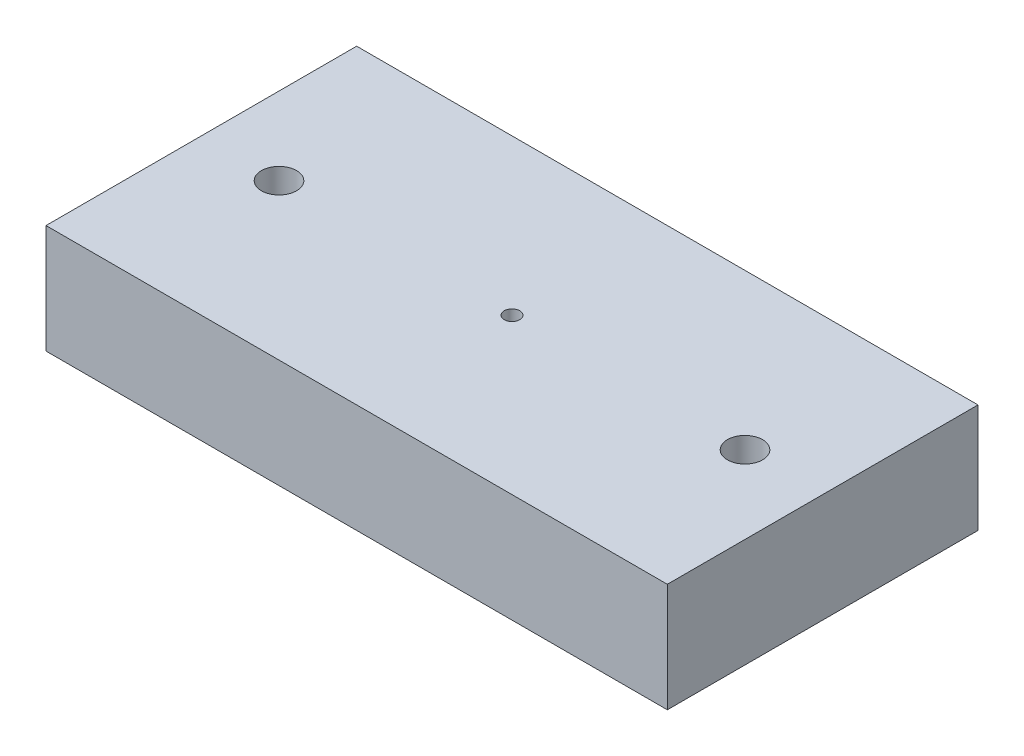
ISO-10303-21;
HEADER;
FILE_DESCRIPTION(('STEP AP214'),'2;1');
FILE_NAME('part.step','',(''),(''),'','','');
FILE_SCHEMA(('AUTOMOTIVE_DESIGN { 1 0 10303 214 1 1 1 1 }'));
ENDSEC;
DATA;
#1=APPLICATION_CONTEXT('core data for automotive mechanical design processes');
#2=APPLICATION_PROTOCOL_DEFINITION('international standard','automotive_design',2000,#1);
#3=PRODUCT_CONTEXT('',#1,'mechanical');
#4=PRODUCT('Part','Part','',(#3));
#5=PRODUCT_RELATED_PRODUCT_CATEGORY('part','',(#4));
#6=PRODUCT_DEFINITION_FORMATION('','',#4);
#7=PRODUCT_DEFINITION_CONTEXT('part definition',#1,'design');
#8=PRODUCT_DEFINITION('design','',#6,#7);
#9=PRODUCT_DEFINITION_SHAPE('','',#8);
#10=(LENGTH_UNIT() NAMED_UNIT(*) SI_UNIT(.MILLI.,.METRE.));
#11=(NAMED_UNIT(*) PLANE_ANGLE_UNIT() SI_UNIT($,.RADIAN.));
#12=(NAMED_UNIT(*) SI_UNIT($,.STERADIAN.) SOLID_ANGLE_UNIT());
#13=UNCERTAINTY_MEASURE_WITH_UNIT(LENGTH_MEASURE(1.E-05),#10,'distance_accuracy_value','');
#14=(GEOMETRIC_REPRESENTATION_CONTEXT(3) GLOBAL_UNCERTAINTY_ASSIGNED_CONTEXT((#13)) GLOBAL_UNIT_ASSIGNED_CONTEXT((#10,
#11,#12)) REPRESENTATION_CONTEXT('',''));
#15=CARTESIAN_POINT('',(0.,0.,0.));
#16=DIRECTION('',(0.,0.,1.));
#17=DIRECTION('',(1.,0.,0.));
#18=AXIS2_PLACEMENT_3D('',#15,#16,#17);
#19=CARTESIAN_POINT('',(0.,0.280000000000001,0.));
#20=DIRECTION('',(0.,1.,0.));
#21=DIRECTION('',(0.,0.,1.));
#22=AXIS2_PLACEMENT_3D('',#19,#20,#21);
#23=CYLINDRICAL_SURFACE('',#22,0.5);
#24=CARTESIAN_POINT('',(0.,7.,0.));
#25=DIRECTION('',(0.,1.,0.));
#26=DIRECTION('',(0.,0.,1.));
#27=AXIS2_PLACEMENT_3D('',#24,#25,#26);
#28=CIRCLE('',#27,0.5);
#29=CARTESIAN_POINT('',(0.,7.,0.5));
#30=VERTEX_POINT('',#29);
#31=EDGE_CURVE('E179',#30,#30,#28,.T.);
#32=ORIENTED_EDGE('',*,*,#31,.T.);
#33=EDGE_LOOP('',(#32));
#34=FACE_BOUND('',#33,.T.);
#35=CARTESIAN_POINT('',(0.,0.5,0.));
#36=DIRECTION('',(0.,-1.,0.));
#37=DIRECTION('',(0.,0.,-1.));
#38=AXIS2_PLACEMENT_3D('',#35,#36,#37);
#39=CIRCLE('',#38,0.5);
#40=CARTESIAN_POINT('',(0.,0.5,-0.5));
#41=VERTEX_POINT('',#40);
#42=EDGE_CURVE('E39',#41,#41,#39,.F.);
#43=ORIENTED_EDGE('',*,*,#42,.F.);
#44=EDGE_LOOP('',(#43));
#45=FACE_BOUND('',#44,.T.);
#46=ADVANCED_FACE('F35',(#34,#45),#23,.F.);
#47=CARTESIAN_POINT('',(20.,7.,10.));
#48=DIRECTION('',(-1.,0.,0.));
#49=DIRECTION('',(0.,0.,1.));
#50=AXIS2_PLACEMENT_3D('',#47,#48,#49);
#51=PLANE('',#50);
#52=DIRECTION('',(0.,0.,-1.));
#53=VECTOR('',#52,1.);
#54=CARTESIAN_POINT('',(20.,0.,10.));
#55=LINE('',#54,#53);
#56=CARTESIAN_POINT('',(20.,0.,10.));
#57=VERTEX_POINT('',#56);
#58=CARTESIAN_POINT('',(20.,0.,-10.));
#59=VERTEX_POINT('',#58);
#60=EDGE_CURVE('E182',#57,#59,#55,.T.);
#61=ORIENTED_EDGE('',*,*,#60,.T.);
#62=DIRECTION('',(0.,-1.,0.));
#63=VECTOR('',#62,1.);
#64=CARTESIAN_POINT('',(20.,7.,-10.));
#65=LINE('',#64,#63);
#66=CARTESIAN_POINT('',(20.,7.,-10.));
#67=VERTEX_POINT('',#66);
#68=EDGE_CURVE('E11',#67,#59,#65,.T.);
#69=ORIENTED_EDGE('',*,*,#68,.F.);
#70=DIRECTION('',(0.,0.,-1.));
#71=VECTOR('',#70,1.);
#72=CARTESIAN_POINT('',(20.,7.,10.));
#73=LINE('',#72,#71);
#74=CARTESIAN_POINT('',(20.,7.,10.));
#75=VERTEX_POINT('',#74);
#76=EDGE_CURVE('E183',#75,#67,#73,.T.);
#77=ORIENTED_EDGE('',*,*,#76,.F.);
#78=DIRECTION('',(0.,-1.,0.));
#79=VECTOR('',#78,1.);
#80=CARTESIAN_POINT('',(20.,7.,10.));
#81=LINE('',#80,#79);
#82=EDGE_CURVE('E189',#75,#57,#81,.T.);
#83=ORIENTED_EDGE('',*,*,#82,.T.);
#84=EDGE_LOOP('',(#61,#69,#77,#83));
#85=FACE_BOUND('',#84,.T.);
#86=ADVANCED_FACE('F37',(#85),#51,.F.);
#87=CARTESIAN_POINT('',(-20.,7.,-10.));
#88=DIRECTION('',(0.,0.,1.));
#89=DIRECTION('',(1.,0.,0.));
#90=AXIS2_PLACEMENT_3D('',#87,#88,#89);
#91=PLANE('',#90);
#92=DIRECTION('',(-1.,0.,0.));
#93=VECTOR('',#92,1.);
#94=CARTESIAN_POINT('',(-20.,0.,-10.));
#95=LINE('',#94,#93);
#96=CARTESIAN_POINT('',(-20.,0.,-10.));
#97=VERTEX_POINT('',#96);
#98=EDGE_CURVE('E192',#59,#97,#95,.T.);
#99=ORIENTED_EDGE('',*,*,#98,.T.);
#100=DIRECTION('',(0.,-1.,0.));
#101=VECTOR('',#100,1.);
#102=CARTESIAN_POINT('',(-20.,7.,-10.));
#103=LINE('',#102,#101);
#104=CARTESIAN_POINT('',(-20.,7.,-10.));
#105=VERTEX_POINT('',#104);
#106=EDGE_CURVE('E44',#105,#97,#103,.T.);
#107=ORIENTED_EDGE('',*,*,#106,.F.);
#108=DIRECTION('',(-1.,0.,0.));
#109=VECTOR('',#108,1.);
#110=CARTESIAN_POINT('',(-20.,7.,-10.));
#111=LINE('',#110,#109);
#112=EDGE_CURVE('E88',#67,#105,#111,.T.);
#113=ORIENTED_EDGE('',*,*,#112,.F.);
#114=ORIENTED_EDGE('',*,*,#68,.T.);
#115=EDGE_LOOP('',(#99,#107,#113,#114));
#116=FACE_BOUND('',#115,.T.);
#117=ADVANCED_FACE('F222',(#116),#91,.F.);
#118=CARTESIAN_POINT('',(-20.,7.,10.));
#119=DIRECTION('',(1.,0.,0.));
#120=DIRECTION('',(0.,0.,-1.));
#121=AXIS2_PLACEMENT_3D('',#118,#119,#120);
#122=PLANE('',#121);
#123=DIRECTION('',(0.,0.,1.));
#124=VECTOR('',#123,1.);
#125=CARTESIAN_POINT('',(-20.,0.,10.));
#126=LINE('',#125,#124);
#127=CARTESIAN_POINT('',(-20.,0.,10.));
#128=VERTEX_POINT('',#127);
#129=EDGE_CURVE('E194',#97,#128,#126,.T.);
#130=ORIENTED_EDGE('',*,*,#129,.T.);
#131=DIRECTION('',(0.,-1.,0.));
#132=VECTOR('',#131,1.);
#133=CARTESIAN_POINT('',(-20.,7.,10.));
#134=LINE('',#133,#132);
#135=CARTESIAN_POINT('',(-20.,7.,10.));
#136=VERTEX_POINT('',#135);
#137=EDGE_CURVE('E198',#136,#128,#134,.T.);
#138=ORIENTED_EDGE('',*,*,#137,.F.);
#139=DIRECTION('',(0.,0.,1.));
#140=VECTOR('',#139,1.);
#141=CARTESIAN_POINT('',(-20.,7.,10.));
#142=LINE('',#141,#140);
#143=EDGE_CURVE('E186',#105,#136,#142,.T.);
#144=ORIENTED_EDGE('',*,*,#143,.F.);
#145=ORIENTED_EDGE('',*,*,#106,.T.);
#146=EDGE_LOOP('',(#130,#138,#144,#145));
#147=FACE_BOUND('',#146,.T.);
#148=ADVANCED_FACE('F204',(#147),#122,.F.);
#149=CARTESIAN_POINT('',(-20.,7.,10.));
#150=DIRECTION('',(0.,0.,-1.));
#151=DIRECTION('',(-1.,0.,0.));
#152=AXIS2_PLACEMENT_3D('',#149,#150,#151);
#153=PLANE('',#152);
#154=DIRECTION('',(1.,0.,0.));
#155=VECTOR('',#154,1.);
#156=CARTESIAN_POINT('',(-20.,0.,10.));
#157=LINE('',#156,#155);
#158=EDGE_CURVE('E81',#128,#57,#157,.T.);
#159=ORIENTED_EDGE('',*,*,#158,.T.);
#160=ORIENTED_EDGE('',*,*,#82,.F.);
#161=DIRECTION('',(1.,0.,0.));
#162=VECTOR('',#161,1.);
#163=CARTESIAN_POINT('',(-20.,7.,10.));
#164=LINE('',#163,#162);
#165=EDGE_CURVE('E60',#136,#75,#164,.T.);
#166=ORIENTED_EDGE('',*,*,#165,.F.);
#167=ORIENTED_EDGE('',*,*,#137,.T.);
#168=EDGE_LOOP('',(#159,#160,#166,#167));
#169=FACE_BOUND('',#168,.T.);
#170=ADVANCED_FACE('F212',(#169),#153,.F.);
#171=CARTESIAN_POINT('',(0.,7.,0.));
#172=DIRECTION('',(0.,-1.,0.));
#173=DIRECTION('',(0.,0.,-1.));
#174=AXIS2_PLACEMENT_3D('',#171,#172,#173);
#175=PLANE('',#174);
#176=CARTESIAN_POINT('',(15.,7.,0.));
#177=DIRECTION('',(0.,-1.,0.));
#178=DIRECTION('',(0.,0.,-1.));
#179=AXIS2_PLACEMENT_3D('',#176,#177,#178);
#180=CIRCLE('',#179,1.1303);
#181=CARTESIAN_POINT('',(15.,7.,-1.13029999999999));
#182=VERTEX_POINT('',#181);
#183=EDGE_CURVE('E167',#182,#182,#180,.T.);
#184=ORIENTED_EDGE('',*,*,#183,.T.);
#185=EDGE_LOOP('',(#184));
#186=FACE_BOUND('',#185,.T.);
#187=CARTESIAN_POINT('',(-15.,7.,0.));
#188=DIRECTION('',(0.,-1.,0.));
#189=DIRECTION('',(0.,0.,-1.));
#190=AXIS2_PLACEMENT_3D('',#187,#188,#189);
#191=CIRCLE('',#190,1.1303);
#192=CARTESIAN_POINT('',(-15.,7.,-1.1303));
#193=VERTEX_POINT('',#192);
#194=EDGE_CURVE('E176',#193,#193,#191,.T.);
#195=ORIENTED_EDGE('',*,*,#194,.T.);
#196=EDGE_LOOP('',(#195));
#197=FACE_BOUND('',#196,.T.);
#198=ORIENTED_EDGE('',*,*,#31,.F.);
#199=EDGE_LOOP('',(#198));
#200=FACE_BOUND('',#199,.T.);
#201=ORIENTED_EDGE('',*,*,#76,.T.);
#202=ORIENTED_EDGE('',*,*,#112,.T.);
#203=ORIENTED_EDGE('',*,*,#143,.T.);
#204=ORIENTED_EDGE('',*,*,#165,.T.);
#205=EDGE_LOOP('',(#201,#202,#203,#204));
#206=FACE_BOUND('',#205,.T.);
#207=ADVANCED_FACE('F214',(#186,#197,#200,#206),#175,.F.);
#208=CARTESIAN_POINT('',(0.,0.,0.));
#209=DIRECTION('',(0.,-1.,0.));
#210=DIRECTION('',(0.,0.,-1.));
#211=AXIS2_PLACEMENT_3D('',#208,#209,#210);
#212=PLANE('',#211);
#213=CARTESIAN_POINT('',(0.,0.,0.));
#214=DIRECTION('',(0.,-1.,0.));
#215=DIRECTION('',(0.,0.,-1.));
#216=AXIS2_PLACEMENT_3D('',#213,#214,#215);
#217=CIRCLE('',#216,5.55);
#218=CARTESIAN_POINT('',(0.,0.,-5.55));
#219=VERTEX_POINT('',#218);
#220=EDGE_CURVE('E152',#219,#219,#217,.T.);
#221=ORIENTED_EDGE('',*,*,#220,.F.);
#222=EDGE_LOOP('',(#221));
#223=FACE_BOUND('',#222,.T.);
#224=CARTESIAN_POINT('',(15.,0.,0.));
#225=DIRECTION('',(0.,-1.,0.));
#226=DIRECTION('',(0.,0.,-1.));
#227=AXIS2_PLACEMENT_3D('',#224,#225,#226);
#228=CIRCLE('',#227,1.7653);
#229=CARTESIAN_POINT('',(15.,0.,-1.7653));
#230=VERTEX_POINT('',#229);
#231=EDGE_CURVE('E159',#230,#230,#228,.T.);
#232=ORIENTED_EDGE('',*,*,#231,.F.);
#233=EDGE_LOOP('',(#232));
#234=FACE_BOUND('',#233,.T.);
#235=CARTESIAN_POINT('',(-15.,0.,0.));
#236=DIRECTION('',(0.,-1.,0.));
#237=DIRECTION('',(0.,0.,-1.));
#238=AXIS2_PLACEMENT_3D('',#235,#236,#237);
#239=CIRCLE('',#238,1.7653);
#240=CARTESIAN_POINT('',(-15.,0.,-1.7653));
#241=VERTEX_POINT('',#240);
#242=EDGE_CURVE('E170',#241,#241,#239,.T.);
#243=ORIENTED_EDGE('',*,*,#242,.F.);
#244=EDGE_LOOP('',(#243));
#245=FACE_BOUND('',#244,.T.);
#246=ORIENTED_EDGE('',*,*,#60,.F.);
#247=ORIENTED_EDGE('',*,*,#158,.F.);
#248=ORIENTED_EDGE('',*,*,#129,.F.);
#249=ORIENTED_EDGE('',*,*,#98,.F.);
#250=EDGE_LOOP('',(#246,#247,#248,#249));
#251=FACE_BOUND('',#250,.T.);
#252=ADVANCED_FACE('F208',(#223,#234,#245,#251),#212,.T.);
#253=CARTESIAN_POINT('',(-15.,0.,0.));
#254=DIRECTION('',(0.,-1.,0.));
#255=DIRECTION('',(0.,0.,-1.));
#256=AXIS2_PLACEMENT_3D('',#253,#254,#255);
#257=CYLINDRICAL_SURFACE('',#256,1.1303);
#258=ORIENTED_EDGE('',*,*,#194,.F.);
#259=EDGE_LOOP('',(#258));
#260=FACE_BOUND('',#259,.T.);
#261=CARTESIAN_POINT('',(-15.,0.634999999999999,0.));
#262=DIRECTION('',(0.,-1.,0.));
#263=DIRECTION('',(0.,0.,-1.));
#264=AXIS2_PLACEMENT_3D('',#261,#262,#263);
#265=CIRCLE('',#264,1.1303);
#266=CARTESIAN_POINT('',(-15.,0.634999999999999,-1.1303));
#267=VERTEX_POINT('',#266);
#268=EDGE_CURVE('E173',#267,#267,#265,.T.);
#269=ORIENTED_EDGE('',*,*,#268,.T.);
#270=EDGE_LOOP('',(#269));
#271=FACE_BOUND('',#270,.T.);
#272=ADVANCED_FACE('F233',(#260,#271),#257,.F.);
#273=CARTESIAN_POINT('',(-15.,0.,0.));
#274=DIRECTION('',(0.,-1.,0.));
#275=DIRECTION('',(0.,0.,-1.));
#276=AXIS2_PLACEMENT_3D('',#273,#274,#275);
#277=CONICAL_SURFACE('',#276,1.7653,0.785398163397449);
#278=ORIENTED_EDGE('',*,*,#268,.F.);
#279=EDGE_LOOP('',(#278));
#280=FACE_BOUND('',#279,.T.);
#281=ORIENTED_EDGE('',*,*,#242,.T.);
#282=EDGE_LOOP('',(#281));
#283=FACE_BOUND('',#282,.T.);
#284=ADVANCED_FACE('F241',(#280,#283),#277,.F.);
#285=CARTESIAN_POINT('',(15.,0.,0.));
#286=DIRECTION('',(0.,-1.,0.));
#287=DIRECTION('',(0.,0.,-1.));
#288=AXIS2_PLACEMENT_3D('',#285,#286,#287);
#289=CYLINDRICAL_SURFACE('',#288,1.1303);
#290=ORIENTED_EDGE('',*,*,#183,.F.);
#291=EDGE_LOOP('',(#290));
#292=FACE_BOUND('',#291,.T.);
#293=CARTESIAN_POINT('',(15.,0.634999999999999,0.));
#294=DIRECTION('',(0.,-1.,0.));
#295=DIRECTION('',(0.,0.,-1.));
#296=AXIS2_PLACEMENT_3D('',#293,#294,#295);
#297=CIRCLE('',#296,1.1303);
#298=CARTESIAN_POINT('',(15.,0.634999999999999,-1.13029999999999));
#299=VERTEX_POINT('',#298);
#300=EDGE_CURVE('E164',#299,#299,#297,.T.);
#301=ORIENTED_EDGE('',*,*,#300,.T.);
#302=EDGE_LOOP('',(#301));
#303=FACE_BOUND('',#302,.T.);
#304=ADVANCED_FACE('F286',(#292,#303),#289,.F.);
#305=CARTESIAN_POINT('',(15.,0.,0.));
#306=DIRECTION('',(0.,-1.,0.));
#307=DIRECTION('',(0.,0.,-1.));
#308=AXIS2_PLACEMENT_3D('',#305,#306,#307);
#309=CONICAL_SURFACE('',#308,1.7653,0.78539816339745);
#310=ORIENTED_EDGE('',*,*,#300,.F.);
#311=EDGE_LOOP('',(#310));
#312=FACE_BOUND('',#311,.T.);
#313=ORIENTED_EDGE('',*,*,#231,.T.);
#314=EDGE_LOOP('',(#313));
#315=FACE_BOUND('',#314,.T.);
#316=ADVANCED_FACE('F282',(#312,#315),#309,.F.);
#317=CARTESIAN_POINT('',(0.,4.9,0.));
#318=DIRECTION('',(0.,-1.,0.));
#319=DIRECTION('',(0.,0.,-1.));
#320=AXIS2_PLACEMENT_3D('',#317,#318,#319);
#321=CYLINDRICAL_SURFACE('',#320,5.55);
#322=CARTESIAN_POINT('',(0.,4.9,0.));
#323=DIRECTION('',(0.,-1.,0.));
#324=DIRECTION('',(0.,0.,-1.));
#325=AXIS2_PLACEMENT_3D('',#322,#323,#324);
#326=CIRCLE('',#325,5.55);
#327=CARTESIAN_POINT('',(0.,4.9,-5.55));
#328=VERTEX_POINT('',#327);
#329=EDGE_CURVE('E156',#328,#328,#326,.T.);
#330=ORIENTED_EDGE('',*,*,#329,.F.);
#331=EDGE_LOOP('',(#330));
#332=FACE_BOUND('',#331,.T.);
#333=ORIENTED_EDGE('',*,*,#220,.T.);
#334=EDGE_LOOP('',(#333));
#335=FACE_BOUND('',#334,.T.);
#336=ADVANCED_FACE('F278',(#332,#335),#321,.F.);
#337=CARTESIAN_POINT('',(0.,4.9,0.));
#338=DIRECTION('',(0.,-1.,0.));
#339=DIRECTION('',(0.,0.,-1.));
#340=AXIS2_PLACEMENT_3D('',#337,#338,#339);
#341=PLANE('',#340);
#342=CARTESIAN_POINT('',(0.,4.9,0.));
#343=DIRECTION('',(0.,-1.,0.));
#344=DIRECTION('',(0.,0.,-1.));
#345=AXIS2_PLACEMENT_3D('',#342,#343,#344);
#346=CIRCLE('',#345,3.97);
#347=CARTESIAN_POINT('',(0.,4.9,-3.97));
#348=VERTEX_POINT('',#347);
#349=EDGE_CURVE('E149',#348,#348,#346,.T.);
#350=ORIENTED_EDGE('',*,*,#349,.F.);
#351=EDGE_LOOP('',(#350));
#352=FACE_BOUND('',#351,.T.);
#353=ORIENTED_EDGE('',*,*,#329,.T.);
#354=EDGE_LOOP('',(#353));
#355=FACE_BOUND('',#354,.T.);
#356=ADVANCED_FACE('F253',(#352,#355),#341,.T.);
#357=CARTESIAN_POINT('',(0.,4.9,0.));
#358=DIRECTION('',(0.,-1.,0.));
#359=DIRECTION('',(0.,0.,-1.));
#360=AXIS2_PLACEMENT_3D('',#357,#358,#359);
#361=CYLINDRICAL_SURFACE('',#360,3.97);
#362=ORIENTED_EDGE('',*,*,#349,.T.);
#363=EDGE_LOOP('',(#362));
#364=FACE_BOUND('',#363,.T.);
#365=CARTESIAN_POINT('',(0.,0.,0.));
#366=DIRECTION('',(0.,-1.,0.));
#367=DIRECTION('',(0.,0.,-1.));
#368=AXIS2_PLACEMENT_3D('',#365,#366,#367);
#369=CIRCLE('',#368,3.97);
#370=CARTESIAN_POINT('',(0.,0.,-3.97));
#371=VERTEX_POINT('',#370);
#372=EDGE_CURVE('E153',#371,#371,#369,.T.);
#373=ORIENTED_EDGE('',*,*,#372,.F.);
#374=EDGE_LOOP('',(#373));
#375=FACE_BOUND('',#374,.T.);
#376=ADVANCED_FACE('F246',(#364,#375),#361,.T.);
#377=DIRECTION('',(0.,0.,1.));
#378=VECTOR('',#377,1.);
#379=CARTESIAN_POINT('',(2.5,0.,1.75));
#380=LINE('',#379,#378);
#381=CARTESIAN_POINT('',(2.5,0.,-1.75));
#382=VERTEX_POINT('',#381);
#383=CARTESIAN_POINT('',(2.5,0.,1.75));
#384=VERTEX_POINT('',#383);
#385=EDGE_CURVE('E51',#382,#384,#380,.T.);
#386=ORIENTED_EDGE('',*,*,#385,.F.);
#387=DIRECTION('',(1.,0.,0.));
#388=VECTOR('',#387,1.);
#389=CARTESIAN_POINT('',(-2.5,0.,-1.75));
#390=LINE('',#389,#388);
#391=CARTESIAN_POINT('',(-2.5,0.,-1.75));
#392=VERTEX_POINT('',#391);
#393=EDGE_CURVE('E131',#392,#382,#390,.T.);
#394=ORIENTED_EDGE('',*,*,#393,.F.);
#395=DIRECTION('',(0.,0.,-1.));
#396=VECTOR('',#395,1.);
#397=CARTESIAN_POINT('',(-2.5,0.,1.75));
#398=LINE('',#397,#396);
#399=CARTESIAN_POINT('',(-2.5,0.,1.75));
#400=VERTEX_POINT('',#399);
#401=EDGE_CURVE('E134',#400,#392,#398,.T.);
#402=ORIENTED_EDGE('',*,*,#401,.F.);
#403=DIRECTION('',(-1.,0.,0.));
#404=VECTOR('',#403,1.);
#405=CARTESIAN_POINT('',(-2.5,0.,1.75));
#406=LINE('',#405,#404);
#407=EDGE_CURVE('E140',#384,#400,#406,.T.);
#408=ORIENTED_EDGE('',*,*,#407,.F.);
#409=EDGE_LOOP('',(#386,#394,#402,#408));
#410=FACE_BOUND('',#409,.T.);
#411=ORIENTED_EDGE('',*,*,#372,.T.);
#412=EDGE_LOOP('',(#411));
#413=FACE_BOUND('',#412,.T.);
#414=ADVANCED_FACE('F237',(#410,#413),#212,.T.);
#415=CARTESIAN_POINT('',(0.,0.5,0.));
#416=DIRECTION('',(0.,-1.,0.));
#417=DIRECTION('',(0.,0.,-1.));
#418=AXIS2_PLACEMENT_3D('',#415,#416,#417);
#419=PLANE('',#418);
#420=DIRECTION('',(0.,0.,1.));
#421=VECTOR('',#420,1.);
#422=CARTESIAN_POINT('',(2.5,0.5,1.75));
#423=LINE('',#422,#421);
#424=CARTESIAN_POINT('',(2.5,0.5,-1.75));
#425=VERTEX_POINT('',#424);
#426=CARTESIAN_POINT('',(2.5,0.5,1.75));
#427=VERTEX_POINT('',#426);
#428=EDGE_CURVE('E112',#425,#427,#423,.T.);
#429=ORIENTED_EDGE('',*,*,#428,.T.);
#430=DIRECTION('',(-1.,0.,0.));
#431=VECTOR('',#430,1.);
#432=CARTESIAN_POINT('',(-2.5,0.5,1.75));
#433=LINE('',#432,#431);
#434=CARTESIAN_POINT('',(-2.5,0.5,1.75));
#435=VERTEX_POINT('',#434);
#436=EDGE_CURVE('E121',#427,#435,#433,.T.);
#437=ORIENTED_EDGE('',*,*,#436,.T.);
#438=DIRECTION('',(0.,0.,-1.));
#439=VECTOR('',#438,1.);
#440=CARTESIAN_POINT('',(-2.5,0.5,1.75));
#441=LINE('',#440,#439);
#442=CARTESIAN_POINT('',(-2.5,0.5,-1.75));
#443=VERTEX_POINT('',#442);
#444=EDGE_CURVE('E126',#435,#443,#441,.T.);
#445=ORIENTED_EDGE('',*,*,#444,.T.);
#446=DIRECTION('',(1.,0.,0.));
#447=VECTOR('',#446,1.);
#448=CARTESIAN_POINT('',(-2.5,0.5,-1.75));
#449=LINE('',#448,#447);
#450=EDGE_CURVE('E118',#443,#425,#449,.T.);
#451=ORIENTED_EDGE('',*,*,#450,.T.);
#452=EDGE_LOOP('',(#429,#437,#445,#451));
#453=FACE_BOUND('',#452,.T.);
#454=ORIENTED_EDGE('',*,*,#42,.T.);
#455=EDGE_LOOP('',(#454));
#456=FACE_BOUND('',#455,.T.);
#457=ADVANCED_FACE('F128',(#453,#456),#419,.T.);
#458=CARTESIAN_POINT('',(2.5,0.5,1.75));
#459=DIRECTION('',(1.,0.,0.));
#460=DIRECTION('',(0.,0.,-1.));
#461=AXIS2_PLACEMENT_3D('',#458,#459,#460);
#462=PLANE('',#461);
#463=ORIENTED_EDGE('',*,*,#385,.T.);
#464=DIRECTION('',(0.,-1.,0.));
#465=VECTOR('',#464,1.);
#466=CARTESIAN_POINT('',(2.5,0.5,1.75));
#467=LINE('',#466,#465);
#468=EDGE_CURVE('E108',#427,#384,#467,.T.);
#469=ORIENTED_EDGE('',*,*,#468,.F.);
#470=ORIENTED_EDGE('',*,*,#428,.F.);
#471=DIRECTION('',(0.,-1.,0.));
#472=VECTOR('',#471,1.);
#473=CARTESIAN_POINT('',(2.5,0.5,-1.75));
#474=LINE('',#473,#472);
#475=EDGE_CURVE('E144',#425,#382,#474,.T.);
#476=ORIENTED_EDGE('',*,*,#475,.T.);
#477=EDGE_LOOP('',(#463,#469,#470,#476));
#478=FACE_BOUND('',#477,.T.);
#479=ADVANCED_FACE('F110',(#478),#462,.F.);
#480=CARTESIAN_POINT('',(-2.5,0.5,-1.75));
#481=DIRECTION('',(0.,0.,-1.));
#482=DIRECTION('',(-1.,0.,0.));
#483=AXIS2_PLACEMENT_3D('',#480,#481,#482);
#484=PLANE('',#483);
#485=ORIENTED_EDGE('',*,*,#393,.T.);
#486=ORIENTED_EDGE('',*,*,#475,.F.);
#487=ORIENTED_EDGE('',*,*,#450,.F.);
#488=DIRECTION('',(0.,-1.,0.));
#489=VECTOR('',#488,1.);
#490=CARTESIAN_POINT('',(-2.5,0.5,-1.75));
#491=LINE('',#490,#489);
#492=EDGE_CURVE('E146',#443,#392,#491,.T.);
#493=ORIENTED_EDGE('',*,*,#492,.T.);
#494=EDGE_LOOP('',(#485,#486,#487,#493));
#495=FACE_BOUND('',#494,.T.);
#496=ADVANCED_FACE('F264',(#495),#484,.F.);
#497=CARTESIAN_POINT('',(-2.5,0.5,1.75));
#498=DIRECTION('',(-1.,0.,0.));
#499=DIRECTION('',(0.,0.,1.));
#500=AXIS2_PLACEMENT_3D('',#497,#498,#499);
#501=PLANE('',#500);
#502=ORIENTED_EDGE('',*,*,#401,.T.);
#503=ORIENTED_EDGE('',*,*,#492,.F.);
#504=ORIENTED_EDGE('',*,*,#444,.F.);
#505=DIRECTION('',(0.,-1.,0.));
#506=VECTOR('',#505,1.);
#507=CARTESIAN_POINT('',(-2.5,0.5,1.75));
#508=LINE('',#507,#506);
#509=EDGE_CURVE('E117',#435,#400,#508,.T.);
#510=ORIENTED_EDGE('',*,*,#509,.T.);
#511=EDGE_LOOP('',(#502,#503,#504,#510));
#512=FACE_BOUND('',#511,.T.);
#513=ADVANCED_FACE('F262',(#512),#501,.F.);
#514=CARTESIAN_POINT('',(-2.5,0.5,1.75));
#515=DIRECTION('',(0.,0.,1.));
#516=DIRECTION('',(1.,0.,0.));
#517=AXIS2_PLACEMENT_3D('',#514,#515,#516);
#518=PLANE('',#517);
#519=ORIENTED_EDGE('',*,*,#407,.T.);
#520=ORIENTED_EDGE('',*,*,#509,.F.);
#521=ORIENTED_EDGE('',*,*,#436,.F.);
#522=ORIENTED_EDGE('',*,*,#468,.T.);
#523=EDGE_LOOP('',(#519,#520,#521,#522));
#524=FACE_BOUND('',#523,.T.);
#525=ADVANCED_FACE('F122',(#524),#518,.F.);
#526=CLOSED_SHELL('',(#46,#86,#117,#148,#170,#207,#252,#272,#284,#304,#316,#336,#356,#376,#414,
#457,#479,#496,#513,#525));
#527=MANIFOLD_SOLID_BREP('B2',#526);
#528=ADVANCED_BREP_SHAPE_REPRESENTATION('',(#18,#527),#14);
#529=SHAPE_DEFINITION_REPRESENTATION(#9,#528);
ENDSEC;
END-ISO-10303-21;
